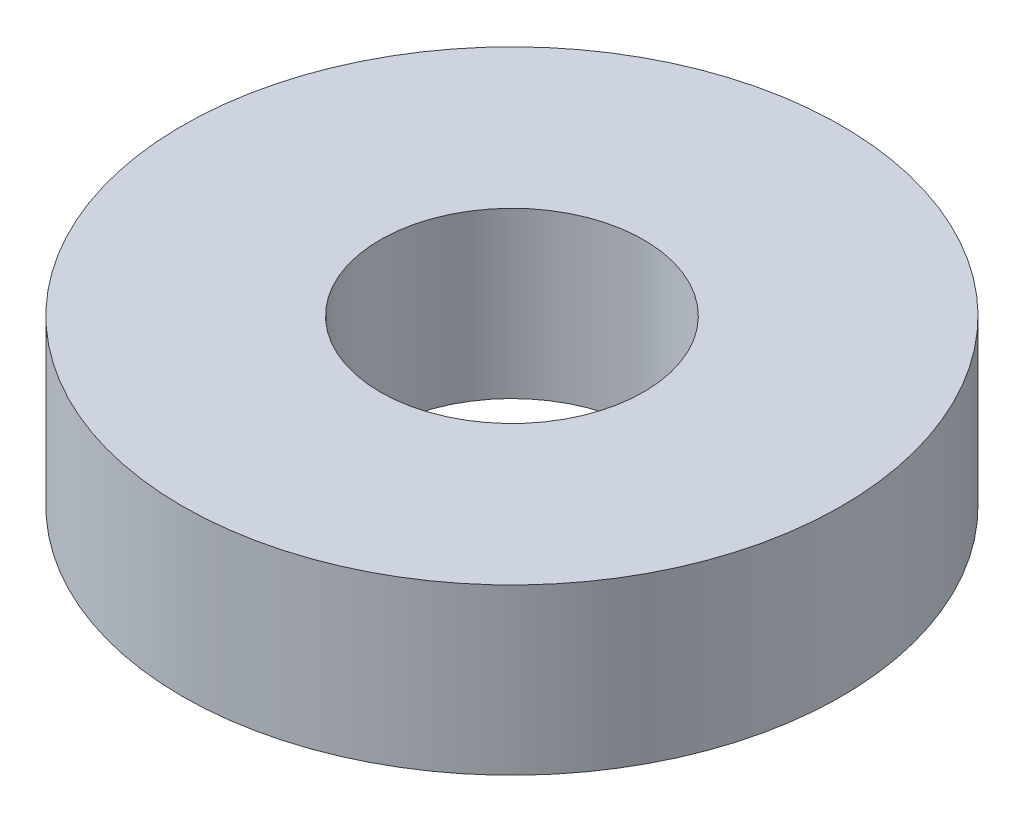
ISO-10303-21;
HEADER;
FILE_DESCRIPTION(('STEP AP214'),'2;1');
FILE_NAME('part.step','',(''),(''),'','','');
FILE_SCHEMA(('AUTOMOTIVE_DESIGN { 1 0 10303 214 1 1 1 1 }'));
ENDSEC;
DATA;
#1=APPLICATION_CONTEXT('core data for automotive mechanical design processes');
#2=APPLICATION_PROTOCOL_DEFINITION('international standard','automotive_design',2000,#1);
#3=PRODUCT_CONTEXT('',#1,'mechanical');
#4=PRODUCT('Part','Part','',(#3));
#5=PRODUCT_RELATED_PRODUCT_CATEGORY('part','',(#4));
#6=PRODUCT_DEFINITION_FORMATION('','',#4);
#7=PRODUCT_DEFINITION_CONTEXT('part definition',#1,'design');
#8=PRODUCT_DEFINITION('design','',#6,#7);
#9=PRODUCT_DEFINITION_SHAPE('','',#8);
#10=(LENGTH_UNIT() NAMED_UNIT(*) SI_UNIT(.MILLI.,.METRE.));
#11=(NAMED_UNIT(*) PLANE_ANGLE_UNIT() SI_UNIT($,.RADIAN.));
#12=(NAMED_UNIT(*) SI_UNIT($,.STERADIAN.) SOLID_ANGLE_UNIT());
#13=UNCERTAINTY_MEASURE_WITH_UNIT(LENGTH_MEASURE(1.E-05),#10,'distance_accuracy_value','');
#14=(GEOMETRIC_REPRESENTATION_CONTEXT(3) GLOBAL_UNCERTAINTY_ASSIGNED_CONTEXT((#13)) GLOBAL_UNIT_ASSIGNED_CONTEXT((#10,
#11,#12)) REPRESENTATION_CONTEXT('',''));
#15=CARTESIAN_POINT('',(0.,0.,0.));
#16=DIRECTION('',(0.,0.,1.));
#17=DIRECTION('',(1.,0.,0.));
#18=AXIS2_PLACEMENT_3D('',#15,#16,#17);
#19=CARTESIAN_POINT('',(0.,2.5,0.));
#20=DIRECTION('',(0.,1.,0.));
#21=DIRECTION('',(0.,0.,1.));
#22=AXIS2_PLACEMENT_3D('',#19,#20,#21);
#23=PLANE('',#22);
#24=CARTESIAN_POINT('',(0.,2.5,0.));
#25=DIRECTION('',(0.,1.,0.));
#26=DIRECTION('',(0.,0.,1.));
#27=AXIS2_PLACEMENT_3D('',#24,#25,#26);
#28=CIRCLE('',#27,5.);
#29=CARTESIAN_POINT('',(0.,2.5,5.));
#30=VERTEX_POINT('',#29);
#31=EDGE_CURVE('E10',#30,#30,#28,.T.);
#32=ORIENTED_EDGE('',*,*,#31,.T.);
#33=EDGE_LOOP('',(#32));
#34=FACE_BOUND('',#33,.T.);
#35=CARTESIAN_POINT('',(0.,2.5,0.));
#36=DIRECTION('',(0.,1.,0.));
#37=DIRECTION('',(0.,0.,1.));
#38=AXIS2_PLACEMENT_3D('',#35,#36,#37);
#39=CIRCLE('',#38,2.);
#40=CARTESIAN_POINT('',(0.,2.5,2.));
#41=VERTEX_POINT('',#40);
#42=EDGE_CURVE('E43',#41,#41,#39,.T.);
#43=ORIENTED_EDGE('',*,*,#42,.F.);
#44=EDGE_LOOP('',(#43));
#45=FACE_BOUND('',#44,.T.);
#46=ADVANCED_FACE('F32',(#34,#45),#23,.T.);
#47=CARTESIAN_POINT('',(0.,0.,0.));
#48=DIRECTION('',(0.,1.,0.));
#49=DIRECTION('',(0.,0.,1.));
#50=AXIS2_PLACEMENT_3D('',#47,#48,#49);
#51=PLANE('',#50);
#52=CARTESIAN_POINT('',(0.,0.,0.));
#53=DIRECTION('',(0.,1.,0.));
#54=DIRECTION('',(0.,0.,1.));
#55=AXIS2_PLACEMENT_3D('',#52,#53,#54);
#56=CIRCLE('',#55,5.);
#57=CARTESIAN_POINT('',(0.,0.,5.));
#58=VERTEX_POINT('',#57);
#59=EDGE_CURVE('E36',#58,#58,#56,.T.);
#60=ORIENTED_EDGE('',*,*,#59,.F.);
#61=EDGE_LOOP('',(#60));
#62=FACE_BOUND('',#61,.T.);
#63=CARTESIAN_POINT('',(0.,0.,0.));
#64=DIRECTION('',(0.,1.,0.));
#65=DIRECTION('',(0.,0.,1.));
#66=AXIS2_PLACEMENT_3D('',#63,#64,#65);
#67=CIRCLE('',#66,2.);
#68=CARTESIAN_POINT('',(0.,0.,2.));
#69=VERTEX_POINT('',#68);
#70=EDGE_CURVE('E45',#69,#69,#67,.T.);
#71=ORIENTED_EDGE('',*,*,#70,.T.);
#72=EDGE_LOOP('',(#71));
#73=FACE_BOUND('',#72,.T.);
#74=ADVANCED_FACE('F55',(#62,#73),#51,.F.);
#75=CARTESIAN_POINT('',(0.,2.5,0.));
#76=DIRECTION('',(0.,-1.,0.));
#77=DIRECTION('',(0.,0.,-1.));
#78=AXIS2_PLACEMENT_3D('',#75,#76,#77);
#79=CYLINDRICAL_SURFACE('',#78,5.);
#80=ORIENTED_EDGE('',*,*,#31,.F.);
#81=EDGE_LOOP('',(#80));
#82=FACE_BOUND('',#81,.T.);
#83=ORIENTED_EDGE('',*,*,#59,.T.);
#84=EDGE_LOOP('',(#83));
#85=FACE_BOUND('',#84,.T.);
#86=ADVANCED_FACE('F34',(#82,#85),#79,.T.);
#87=CARTESIAN_POINT('',(0.,2.5,0.));
#88=DIRECTION('',(0.,-1.,0.));
#89=DIRECTION('',(0.,0.,-1.));
#90=AXIS2_PLACEMENT_3D('',#87,#88,#89);
#91=CYLINDRICAL_SURFACE('',#90,2.);
#92=ORIENTED_EDGE('',*,*,#42,.T.);
#93=EDGE_LOOP('',(#92));
#94=FACE_BOUND('',#93,.T.);
#95=ORIENTED_EDGE('',*,*,#70,.F.);
#96=EDGE_LOOP('',(#95));
#97=FACE_BOUND('',#96,.T.);
#98=ADVANCED_FACE('F51',(#94,#97),#91,.F.);
#99=CLOSED_SHELL('',(#46,#74,#86,#98));
#100=MANIFOLD_SOLID_BREP('B2',#99);
#101=ADVANCED_BREP_SHAPE_REPRESENTATION('',(#18,#100),#14);
#102=SHAPE_DEFINITION_REPRESENTATION(#9,#101);
ENDSEC;
END-ISO-10303-21;
